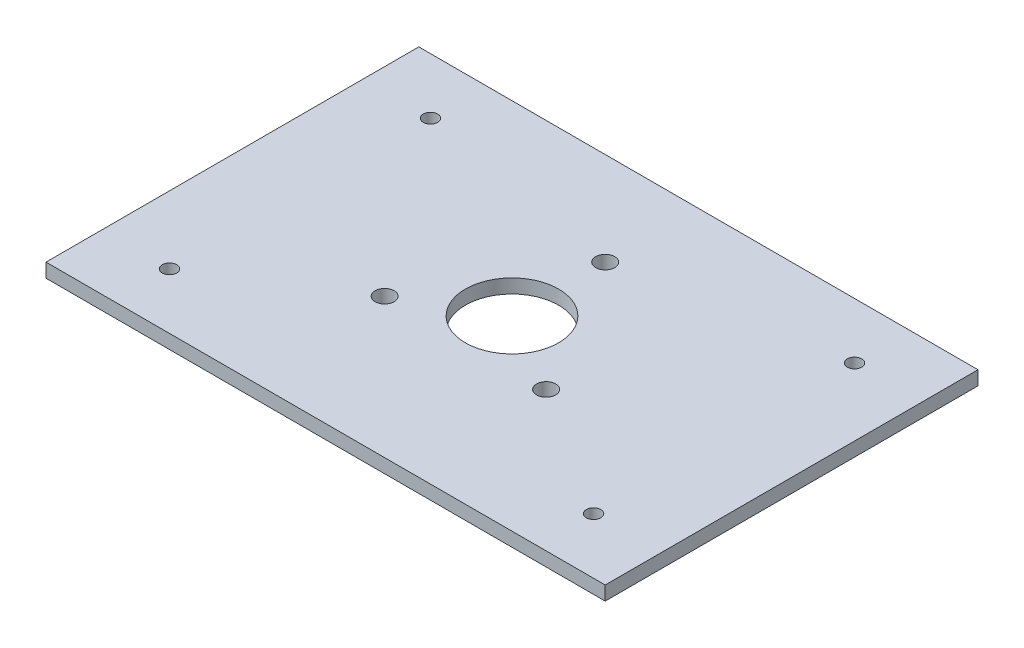
ISO-10303-21;
HEADER;
FILE_DESCRIPTION(('STEP AP214'),'2;1');
FILE_NAME('part.step','',(''),(''),'','','');
FILE_SCHEMA(('AUTOMOTIVE_DESIGN { 1 0 10303 214 1 1 1 1 }'));
ENDSEC;
DATA;
#1=APPLICATION_CONTEXT('core data for automotive mechanical design processes');
#2=APPLICATION_PROTOCOL_DEFINITION('international standard','automotive_design',2000,#1);
#3=PRODUCT_CONTEXT('',#1,'mechanical');
#4=PRODUCT('Part','Part','',(#3));
#5=PRODUCT_RELATED_PRODUCT_CATEGORY('part','',(#4));
#6=PRODUCT_DEFINITION_FORMATION('','',#4);
#7=PRODUCT_DEFINITION_CONTEXT('part definition',#1,'design');
#8=PRODUCT_DEFINITION('design','',#6,#7);
#9=PRODUCT_DEFINITION_SHAPE('','',#8);
#10=(LENGTH_UNIT() NAMED_UNIT(*) SI_UNIT(.MILLI.,.METRE.));
#11=(NAMED_UNIT(*) PLANE_ANGLE_UNIT() SI_UNIT($,.RADIAN.));
#12=(NAMED_UNIT(*) SI_UNIT($,.STERADIAN.) SOLID_ANGLE_UNIT());
#13=UNCERTAINTY_MEASURE_WITH_UNIT(LENGTH_MEASURE(1.E-05),#10,'distance_accuracy_value','');
#14=(GEOMETRIC_REPRESENTATION_CONTEXT(3) GLOBAL_UNCERTAINTY_ASSIGNED_CONTEXT((#13)) GLOBAL_UNIT_ASSIGNED_CONTEXT((#10,
#11,#12)) REPRESENTATION_CONTEXT('',''));
#15=CARTESIAN_POINT('',(0.,0.,0.));
#16=DIRECTION('',(0.,0.,1.));
#17=DIRECTION('',(1.,0.,0.));
#18=AXIS2_PLACEMENT_3D('',#15,#16,#17);
#19=CARTESIAN_POINT('',(0.,3.,0.));
#20=DIRECTION('',(0.,-1.,0.));
#21=DIRECTION('',(0.,0.,-1.));
#22=AXIS2_PLACEMENT_3D('',#19,#20,#21);
#23=PLANE('',#22);
#24=DIRECTION('',(0.,0.,1.));
#25=VECTOR('',#24,1.);
#26=CARTESIAN_POINT('',(0.,3.,0.));
#27=LINE('',#26,#25);
#28=CARTESIAN_POINT('',(0.,3.,-80.));
#29=VERTEX_POINT('',#28);
#30=CARTESIAN_POINT('',(0.,3.,0.));
#31=VERTEX_POINT('',#30);
#32=EDGE_CURVE('E85',#29,#31,#27,.T.);
#33=ORIENTED_EDGE('',*,*,#32,.T.);
#34=DIRECTION('',(1.,0.,0.));
#35=VECTOR('',#34,1.);
#36=CARTESIAN_POINT('',(0.,3.,0.));
#37=LINE('',#36,#35);
#38=CARTESIAN_POINT('',(120.,3.,0.));
#39=VERTEX_POINT('',#38);
#40=EDGE_CURVE('E80',#31,#39,#37,.T.);
#41=ORIENTED_EDGE('',*,*,#40,.T.);
#42=DIRECTION('',(0.,0.,-1.));
#43=VECTOR('',#42,1.);
#44=CARTESIAN_POINT('',(120.,3.,0.));
#45=LINE('',#44,#43);
#46=CARTESIAN_POINT('',(120.,3.,-80.));
#47=VERTEX_POINT('',#46);
#48=EDGE_CURVE('E83',#39,#47,#45,.T.);
#49=ORIENTED_EDGE('',*,*,#48,.T.);
#50=DIRECTION('',(-1.,0.,0.));
#51=VECTOR('',#50,1.);
#52=CARTESIAN_POINT('',(0.,3.,-80.));
#53=LINE('',#52,#51);
#54=EDGE_CURVE('E50',#47,#29,#53,.T.);
#55=ORIENTED_EDGE('',*,*,#54,.T.);
#56=EDGE_LOOP('',(#33,#41,#49,#55));
#57=FACE_BOUND('',#56,.T.);
#58=CARTESIAN_POINT('',(60.,3.,-60.));
#59=DIRECTION('',(0.,1.,0.));
#60=DIRECTION('',(0.,0.,1.));
#61=AXIS2_PLACEMENT_3D('',#58,#59,#60);
#62=CIRCLE('',#61,2.04999999999999);
#63=CARTESIAN_POINT('',(60.,3.,-57.95));
#64=VERTEX_POINT('',#63);
#65=EDGE_CURVE('E100',#64,#64,#62,.T.);
#66=ORIENTED_EDGE('',*,*,#65,.F.);
#67=EDGE_LOOP('',(#66));
#68=FACE_BOUND('',#67,.T.);
#69=CARTESIAN_POINT('',(60.,3.,-40.));
#70=DIRECTION('',(0.,1.,0.));
#71=DIRECTION('',(0.,0.,1.));
#72=AXIS2_PLACEMENT_3D('',#69,#70,#71);
#73=CIRCLE('',#72,10.);
#74=CARTESIAN_POINT('',(60.,3.,-30.));
#75=VERTEX_POINT('',#74);
#76=EDGE_CURVE('E115',#75,#75,#73,.T.);
#77=ORIENTED_EDGE('',*,*,#76,.F.);
#78=EDGE_LOOP('',(#77));
#79=FACE_BOUND('',#78,.T.);
#80=CARTESIAN_POINT('',(77.3205080756896,3.,-30.0000000000004));
#81=DIRECTION('',(0.,1.,0.));
#82=DIRECTION('',(0.,0.,1.));
#83=AXIS2_PLACEMENT_3D('',#80,#81,#82);
#84=CIRCLE('',#83,2.04999999999998);
#85=CARTESIAN_POINT('',(77.3205080756896,3.,-27.9500000000004));
#86=VERTEX_POINT('',#85);
#87=EDGE_CURVE('E121',#86,#86,#84,.T.);
#88=ORIENTED_EDGE('',*,*,#87,.F.);
#89=EDGE_LOOP('',(#88));
#90=FACE_BOUND('',#89,.T.);
#91=CARTESIAN_POINT('',(42.679491924312,3.,-29.9999999999997));
#92=DIRECTION('',(0.,1.,0.));
#93=DIRECTION('',(0.,0.,1.));
#94=AXIS2_PLACEMENT_3D('',#91,#92,#93);
#95=CIRCLE('',#94,2.04999999999999);
#96=CARTESIAN_POINT('',(42.679491924312,3.,-27.9499999999997));
#97=VERTEX_POINT('',#96);
#98=EDGE_CURVE('E127',#97,#97,#95,.T.);
#99=ORIENTED_EDGE('',*,*,#98,.F.);
#100=EDGE_LOOP('',(#99));
#101=FACE_BOUND('',#100,.T.);
#102=CARTESIAN_POINT('',(14.5,3.,-68.));
#103=DIRECTION('',(0.,1.,0.));
#104=DIRECTION('',(0.,0.,1.));
#105=AXIS2_PLACEMENT_3D('',#102,#103,#104);
#106=CIRCLE('',#105,1.55);
#107=CARTESIAN_POINT('',(14.5,3.,-66.45));
#108=VERTEX_POINT('',#107);
#109=EDGE_CURVE('E133',#108,#108,#106,.T.);
#110=ORIENTED_EDGE('',*,*,#109,.F.);
#111=EDGE_LOOP('',(#110));
#112=FACE_BOUND('',#111,.T.);
#113=CARTESIAN_POINT('',(14.5,3.,-12.));
#114=DIRECTION('',(0.,1.,0.));
#115=DIRECTION('',(0.,0.,-1.));
#116=AXIS2_PLACEMENT_3D('',#113,#114,#115);
#117=CIRCLE('',#116,1.55);
#118=CARTESIAN_POINT('',(14.5,3.,-13.55));
#119=VERTEX_POINT('',#118);
#120=EDGE_CURVE('E139',#119,#119,#117,.T.);
#121=ORIENTED_EDGE('',*,*,#120,.F.);
#122=EDGE_LOOP('',(#121));
#123=FACE_BOUND('',#122,.T.);
#124=CARTESIAN_POINT('',(105.5,3.,-12.0000000000001));
#125=DIRECTION('',(0.,1.,0.));
#126=DIRECTION('',(0.,0.,1.));
#127=AXIS2_PLACEMENT_3D('',#124,#125,#126);
#128=CIRCLE('',#127,1.54999999999999);
#129=CARTESIAN_POINT('',(105.5,3.,-10.4500000000001));
#130=VERTEX_POINT('',#129);
#131=EDGE_CURVE('E145',#130,#130,#128,.T.);
#132=ORIENTED_EDGE('',*,*,#131,.F.);
#133=EDGE_LOOP('',(#132));
#134=FACE_BOUND('',#133,.T.);
#135=CARTESIAN_POINT('',(105.5,3.,-68.));
#136=DIRECTION('',(0.,1.,0.));
#137=DIRECTION('',(0.,0.,-1.));
#138=AXIS2_PLACEMENT_3D('',#135,#136,#137);
#139=CIRCLE('',#138,1.54999999999999);
#140=CARTESIAN_POINT('',(105.5,3.,-69.55));
#141=VERTEX_POINT('',#140);
#142=EDGE_CURVE('E151',#141,#141,#139,.T.);
#143=ORIENTED_EDGE('',*,*,#142,.F.);
#144=EDGE_LOOP('',(#143));
#145=FACE_BOUND('',#144,.T.);
#146=ADVANCED_FACE('F33',(#57,#68,#79,#90,#101,#112,#123,#134,#145),#23,.F.);
#147=CARTESIAN_POINT('',(0.,0.,0.));
#148=DIRECTION('',(0.,-1.,0.));
#149=DIRECTION('',(0.,0.,-1.));
#150=AXIS2_PLACEMENT_3D('',#147,#148,#149);
#151=PLANE('',#150);
#152=CARTESIAN_POINT('',(105.5,0.,-12.0000000000001));
#153=DIRECTION('',(0.,1.,0.));
#154=DIRECTION('',(0.,0.,1.));
#155=AXIS2_PLACEMENT_3D('',#152,#153,#154);
#156=CIRCLE('',#155,1.54999999999999);
#157=CARTESIAN_POINT('',(105.5,0.,-10.4500000000001));
#158=VERTEX_POINT('',#157);
#159=EDGE_CURVE('E148',#158,#158,#156,.T.);
#160=ORIENTED_EDGE('',*,*,#159,.T.);
#161=EDGE_LOOP('',(#160));
#162=FACE_BOUND('',#161,.T.);
#163=CARTESIAN_POINT('',(14.5,0.,-68.));
#164=DIRECTION('',(0.,1.,0.));
#165=DIRECTION('',(0.,0.,1.));
#166=AXIS2_PLACEMENT_3D('',#163,#164,#165);
#167=CIRCLE('',#166,1.55);
#168=CARTESIAN_POINT('',(14.5,0.,-66.45));
#169=VERTEX_POINT('',#168);
#170=EDGE_CURVE('E136',#169,#169,#167,.T.);
#171=ORIENTED_EDGE('',*,*,#170,.T.);
#172=EDGE_LOOP('',(#171));
#173=FACE_BOUND('',#172,.T.);
#174=CARTESIAN_POINT('',(77.3205080756896,0.,-30.0000000000004));
#175=DIRECTION('',(0.,1.,0.));
#176=DIRECTION('',(0.,0.,1.));
#177=AXIS2_PLACEMENT_3D('',#174,#175,#176);
#178=CIRCLE('',#177,2.04999999999998);
#179=CARTESIAN_POINT('',(77.3205080756896,0.,-27.9500000000004));
#180=VERTEX_POINT('',#179);
#181=EDGE_CURVE('E124',#180,#180,#178,.T.);
#182=ORIENTED_EDGE('',*,*,#181,.T.);
#183=EDGE_LOOP('',(#182));
#184=FACE_BOUND('',#183,.T.);
#185=CARTESIAN_POINT('',(60.,0.,-60.));
#186=DIRECTION('',(0.,1.,0.));
#187=DIRECTION('',(0.,0.,1.));
#188=AXIS2_PLACEMENT_3D('',#185,#186,#187);
#189=CIRCLE('',#188,2.04999999999999);
#190=CARTESIAN_POINT('',(60.,0.,-57.95));
#191=VERTEX_POINT('',#190);
#192=EDGE_CURVE('E112',#191,#191,#189,.T.);
#193=ORIENTED_EDGE('',*,*,#192,.T.);
#194=EDGE_LOOP('',(#193));
#195=FACE_BOUND('',#194,.T.);
#196=DIRECTION('',(0.,0.,1.));
#197=VECTOR('',#196,1.);
#198=CARTESIAN_POINT('',(0.,0.,0.));
#199=LINE('',#198,#197);
#200=CARTESIAN_POINT('',(0.,0.,-80.));
#201=VERTEX_POINT('',#200);
#202=CARTESIAN_POINT('',(0.,0.,0.));
#203=VERTEX_POINT('',#202);
#204=EDGE_CURVE('E97',#201,#203,#199,.T.);
#205=ORIENTED_EDGE('',*,*,#204,.F.);
#206=DIRECTION('',(-1.,0.,0.));
#207=VECTOR('',#206,1.);
#208=CARTESIAN_POINT('',(0.,0.,-80.));
#209=LINE('',#208,#207);
#210=CARTESIAN_POINT('',(120.,0.,-80.));
#211=VERTEX_POINT('',#210);
#212=EDGE_CURVE('E73',#211,#201,#209,.T.);
#213=ORIENTED_EDGE('',*,*,#212,.F.);
#214=DIRECTION('',(0.,0.,-1.));
#215=VECTOR('',#214,1.);
#216=CARTESIAN_POINT('',(120.,0.,0.));
#217=LINE('',#216,#215);
#218=CARTESIAN_POINT('',(120.,0.,0.));
#219=VERTEX_POINT('',#218);
#220=EDGE_CURVE('E67',#219,#211,#217,.T.);
#221=ORIENTED_EDGE('',*,*,#220,.F.);
#222=DIRECTION('',(1.,0.,0.));
#223=VECTOR('',#222,1.);
#224=CARTESIAN_POINT('',(0.,0.,0.));
#225=LINE('',#224,#223);
#226=EDGE_CURVE('E89',#203,#219,#225,.T.);
#227=ORIENTED_EDGE('',*,*,#226,.F.);
#228=EDGE_LOOP('',(#205,#213,#221,#227));
#229=FACE_BOUND('',#228,.T.);
#230=CARTESIAN_POINT('',(60.,0.,-40.));
#231=DIRECTION('',(0.,1.,0.));
#232=DIRECTION('',(0.,0.,1.));
#233=AXIS2_PLACEMENT_3D('',#230,#231,#232);
#234=CIRCLE('',#233,10.);
#235=CARTESIAN_POINT('',(60.,0.,-30.));
#236=VERTEX_POINT('',#235);
#237=EDGE_CURVE('E118',#236,#236,#234,.T.);
#238=ORIENTED_EDGE('',*,*,#237,.T.);
#239=EDGE_LOOP('',(#238));
#240=FACE_BOUND('',#239,.T.);
#241=CARTESIAN_POINT('',(42.679491924312,0.,-29.9999999999997));
#242=DIRECTION('',(0.,1.,0.));
#243=DIRECTION('',(0.,0.,1.));
#244=AXIS2_PLACEMENT_3D('',#241,#242,#243);
#245=CIRCLE('',#244,2.04999999999999);
#246=CARTESIAN_POINT('',(42.679491924312,0.,-27.9499999999997));
#247=VERTEX_POINT('',#246);
#248=EDGE_CURVE('E130',#247,#247,#245,.T.);
#249=ORIENTED_EDGE('',*,*,#248,.T.);
#250=EDGE_LOOP('',(#249));
#251=FACE_BOUND('',#250,.T.);
#252=CARTESIAN_POINT('',(14.5,0.,-12.));
#253=DIRECTION('',(0.,1.,0.));
#254=DIRECTION('',(0.,0.,-1.));
#255=AXIS2_PLACEMENT_3D('',#252,#253,#254);
#256=CIRCLE('',#255,1.55);
#257=CARTESIAN_POINT('',(14.5,0.,-13.55));
#258=VERTEX_POINT('',#257);
#259=EDGE_CURVE('E142',#258,#258,#256,.T.);
#260=ORIENTED_EDGE('',*,*,#259,.T.);
#261=EDGE_LOOP('',(#260));
#262=FACE_BOUND('',#261,.T.);
#263=CARTESIAN_POINT('',(105.5,0.,-68.));
#264=DIRECTION('',(0.,1.,0.));
#265=DIRECTION('',(0.,0.,-1.));
#266=AXIS2_PLACEMENT_3D('',#263,#264,#265);
#267=CIRCLE('',#266,1.54999999999999);
#268=CARTESIAN_POINT('',(105.5,0.,-69.55));
#269=VERTEX_POINT('',#268);
#270=EDGE_CURVE('E154',#269,#269,#267,.T.);
#271=ORIENTED_EDGE('',*,*,#270,.T.);
#272=EDGE_LOOP('',(#271));
#273=FACE_BOUND('',#272,.T.);
#274=ADVANCED_FACE('F108',(#162,#173,#184,#195,#229,#240,#251,#262,#273),#151,.T.);
#275=CARTESIAN_POINT('',(0.,3.,0.));
#276=DIRECTION('',(1.,0.,0.));
#277=DIRECTION('',(0.,0.,-1.));
#278=AXIS2_PLACEMENT_3D('',#275,#276,#277);
#279=PLANE('',#278);
#280=ORIENTED_EDGE('',*,*,#204,.T.);
#281=DIRECTION('',(0.,-1.,0.));
#282=VECTOR('',#281,1.);
#283=CARTESIAN_POINT('',(0.,3.,0.));
#284=LINE('',#283,#282);
#285=EDGE_CURVE('E11',#31,#203,#284,.T.);
#286=ORIENTED_EDGE('',*,*,#285,.F.);
#287=ORIENTED_EDGE('',*,*,#32,.F.);
#288=DIRECTION('',(0.,-1.,0.));
#289=VECTOR('',#288,1.);
#290=CARTESIAN_POINT('',(0.,3.,-80.));
#291=LINE('',#290,#289);
#292=EDGE_CURVE('E93',#29,#201,#291,.T.);
#293=ORIENTED_EDGE('',*,*,#292,.T.);
#294=EDGE_LOOP('',(#280,#286,#287,#293));
#295=FACE_BOUND('',#294,.T.);
#296=ADVANCED_FACE('F35',(#295),#279,.F.);
#297=CARTESIAN_POINT('',(0.,3.,0.));
#298=DIRECTION('',(0.,0.,-1.));
#299=DIRECTION('',(-1.,0.,0.));
#300=AXIS2_PLACEMENT_3D('',#297,#298,#299);
#301=PLANE('',#300);
#302=ORIENTED_EDGE('',*,*,#226,.T.);
#303=DIRECTION('',(0.,-1.,0.));
#304=VECTOR('',#303,1.);
#305=CARTESIAN_POINT('',(120.,3.,0.));
#306=LINE('',#305,#304);
#307=EDGE_CURVE('E42',#39,#219,#306,.T.);
#308=ORIENTED_EDGE('',*,*,#307,.F.);
#309=ORIENTED_EDGE('',*,*,#40,.F.);
#310=ORIENTED_EDGE('',*,*,#285,.T.);
#311=EDGE_LOOP('',(#302,#308,#309,#310));
#312=FACE_BOUND('',#311,.T.);
#313=ADVANCED_FACE('F88',(#312),#301,.F.);
#314=CARTESIAN_POINT('',(120.,3.,0.));
#315=DIRECTION('',(-1.,0.,0.));
#316=DIRECTION('',(0.,0.,1.));
#317=AXIS2_PLACEMENT_3D('',#314,#315,#316);
#318=PLANE('',#317);
#319=ORIENTED_EDGE('',*,*,#220,.T.);
#320=DIRECTION('',(0.,-1.,0.));
#321=VECTOR('',#320,1.);
#322=CARTESIAN_POINT('',(120.,3.,-80.));
#323=LINE('',#322,#321);
#324=EDGE_CURVE('E90',#47,#211,#323,.T.);
#325=ORIENTED_EDGE('',*,*,#324,.F.);
#326=ORIENTED_EDGE('',*,*,#48,.F.);
#327=ORIENTED_EDGE('',*,*,#307,.T.);
#328=EDGE_LOOP('',(#319,#325,#326,#327));
#329=FACE_BOUND('',#328,.T.);
#330=ADVANCED_FACE('F91',(#329),#318,.F.);
#331=CARTESIAN_POINT('',(0.,3.,-80.));
#332=DIRECTION('',(0.,0.,1.));
#333=DIRECTION('',(1.,0.,0.));
#334=AXIS2_PLACEMENT_3D('',#331,#332,#333);
#335=PLANE('',#334);
#336=ORIENTED_EDGE('',*,*,#212,.T.);
#337=ORIENTED_EDGE('',*,*,#292,.F.);
#338=ORIENTED_EDGE('',*,*,#54,.F.);
#339=ORIENTED_EDGE('',*,*,#324,.T.);
#340=EDGE_LOOP('',(#336,#337,#338,#339));
#341=FACE_BOUND('',#340,.T.);
#342=ADVANCED_FACE('F105',(#341),#335,.F.);
#343=CARTESIAN_POINT('',(60.,3.,-60.));
#344=DIRECTION('',(0.,-1.,0.));
#345=DIRECTION('',(0.,0.,-1.));
#346=AXIS2_PLACEMENT_3D('',#343,#344,#345);
#347=CYLINDRICAL_SURFACE('',#346,2.04999999999999);
#348=ORIENTED_EDGE('',*,*,#65,.T.);
#349=EDGE_LOOP('',(#348));
#350=FACE_BOUND('',#349,.T.);
#351=ORIENTED_EDGE('',*,*,#192,.F.);
#352=EDGE_LOOP('',(#351));
#353=FACE_BOUND('',#352,.T.);
#354=ADVANCED_FACE('F171',(#350,#353),#347,.F.);
#355=CARTESIAN_POINT('',(60.,3.,-40.));
#356=DIRECTION('',(0.,-1.,0.));
#357=DIRECTION('',(0.,0.,-1.));
#358=AXIS2_PLACEMENT_3D('',#355,#356,#357);
#359=CYLINDRICAL_SURFACE('',#358,10.);
#360=ORIENTED_EDGE('',*,*,#76,.T.);
#361=EDGE_LOOP('',(#360));
#362=FACE_BOUND('',#361,.T.);
#363=ORIENTED_EDGE('',*,*,#237,.F.);
#364=EDGE_LOOP('',(#363));
#365=FACE_BOUND('',#364,.T.);
#366=ADVANCED_FACE('F217',(#362,#365),#359,.F.);
#367=CARTESIAN_POINT('',(77.3205080756896,3.,-30.0000000000004));
#368=DIRECTION('',(0.,-1.,0.));
#369=DIRECTION('',(0.,0.,-1.));
#370=AXIS2_PLACEMENT_3D('',#367,#368,#369);
#371=CYLINDRICAL_SURFACE('',#370,2.04999999999998);
#372=ORIENTED_EDGE('',*,*,#87,.T.);
#373=EDGE_LOOP('',(#372));
#374=FACE_BOUND('',#373,.T.);
#375=ORIENTED_EDGE('',*,*,#181,.F.);
#376=EDGE_LOOP('',(#375));
#377=FACE_BOUND('',#376,.T.);
#378=ADVANCED_FACE('F225',(#374,#377),#371,.F.);
#379=CARTESIAN_POINT('',(42.679491924312,3.,-29.9999999999997));
#380=DIRECTION('',(0.,-1.,0.));
#381=DIRECTION('',(0.,0.,-1.));
#382=AXIS2_PLACEMENT_3D('',#379,#380,#381);
#383=CYLINDRICAL_SURFACE('',#382,2.04999999999999);
#384=ORIENTED_EDGE('',*,*,#98,.T.);
#385=EDGE_LOOP('',(#384));
#386=FACE_BOUND('',#385,.T.);
#387=ORIENTED_EDGE('',*,*,#248,.F.);
#388=EDGE_LOOP('',(#387));
#389=FACE_BOUND('',#388,.T.);
#390=ADVANCED_FACE('F233',(#386,#389),#383,.F.);
#391=CARTESIAN_POINT('',(14.5,3.,-68.));
#392=DIRECTION('',(0.,-1.,0.));
#393=DIRECTION('',(0.,0.,-1.));
#394=AXIS2_PLACEMENT_3D('',#391,#392,#393);
#395=CYLINDRICAL_SURFACE('',#394,1.55);
#396=ORIENTED_EDGE('',*,*,#109,.T.);
#397=EDGE_LOOP('',(#396));
#398=FACE_BOUND('',#397,.T.);
#399=ORIENTED_EDGE('',*,*,#170,.F.);
#400=EDGE_LOOP('',(#399));
#401=FACE_BOUND('',#400,.T.);
#402=ADVANCED_FACE('F242',(#398,#401),#395,.F.);
#403=CARTESIAN_POINT('',(14.5,3.,-12.));
#404=DIRECTION('',(0.,-1.,0.));
#405=DIRECTION('',(0.,0.,-1.));
#406=AXIS2_PLACEMENT_3D('',#403,#404,#405);
#407=CYLINDRICAL_SURFACE('',#406,1.55);
#408=ORIENTED_EDGE('',*,*,#120,.T.);
#409=EDGE_LOOP('',(#408));
#410=FACE_BOUND('',#409,.T.);
#411=ORIENTED_EDGE('',*,*,#259,.F.);
#412=EDGE_LOOP('',(#411));
#413=FACE_BOUND('',#412,.T.);
#414=ADVANCED_FACE('F251',(#410,#413),#407,.F.);
#415=CARTESIAN_POINT('',(105.5,3.,-12.0000000000001));
#416=DIRECTION('',(0.,-1.,0.));
#417=DIRECTION('',(0.,0.,-1.));
#418=AXIS2_PLACEMENT_3D('',#415,#416,#417);
#419=CYLINDRICAL_SURFACE('',#418,1.54999999999999);
#420=ORIENTED_EDGE('',*,*,#131,.T.);
#421=EDGE_LOOP('',(#420));
#422=FACE_BOUND('',#421,.T.);
#423=ORIENTED_EDGE('',*,*,#159,.F.);
#424=EDGE_LOOP('',(#423));
#425=FACE_BOUND('',#424,.T.);
#426=ADVANCED_FACE('F260',(#422,#425),#419,.F.);
#427=CARTESIAN_POINT('',(105.5,3.,-68.));
#428=DIRECTION('',(0.,-1.,0.));
#429=DIRECTION('',(0.,0.,-1.));
#430=AXIS2_PLACEMENT_3D('',#427,#428,#429);
#431=CYLINDRICAL_SURFACE('',#430,1.54999999999999);
#432=ORIENTED_EDGE('',*,*,#142,.T.);
#433=EDGE_LOOP('',(#432));
#434=FACE_BOUND('',#433,.T.);
#435=ORIENTED_EDGE('',*,*,#270,.F.);
#436=EDGE_LOOP('',(#435));
#437=FACE_BOUND('',#436,.T.);
#438=ADVANCED_FACE('F160',(#434,#437),#431,.F.);
#439=CLOSED_SHELL('',(#146,#274,#296,#313,#330,#342,#354,#366,#378,#390,#402,#414,#426,#438));
#440=MANIFOLD_SOLID_BREP('B2',#439);
#441=ADVANCED_BREP_SHAPE_REPRESENTATION('',(#18,#440),#14);
#442=SHAPE_DEFINITION_REPRESENTATION(#9,#441);
ENDSEC;
END-ISO-10303-21;
